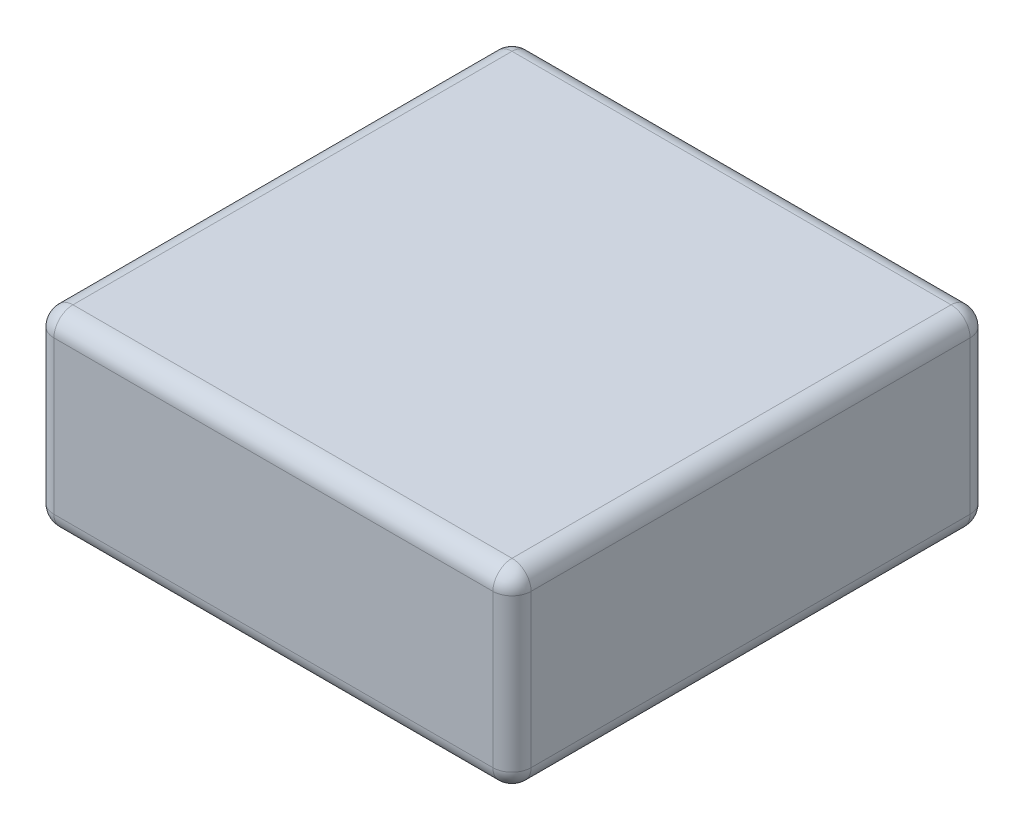
ISO-10303-21;
HEADER;
FILE_DESCRIPTION(('STEP AP214'),'2;1');
FILE_NAME('part.step','',(''),(''),'','','');
FILE_SCHEMA(('AUTOMOTIVE_DESIGN { 1 0 10303 214 1 1 1 1 }'));
ENDSEC;
DATA;
#1=APPLICATION_CONTEXT('core data for automotive mechanical design processes');
#2=APPLICATION_PROTOCOL_DEFINITION('international standard','automotive_design',2000,#1);
#3=PRODUCT_CONTEXT('',#1,'mechanical');
#4=PRODUCT('Part','Part','',(#3));
#5=PRODUCT_RELATED_PRODUCT_CATEGORY('part','',(#4));
#6=PRODUCT_DEFINITION_FORMATION('','',#4);
#7=PRODUCT_DEFINITION_CONTEXT('part definition',#1,'design');
#8=PRODUCT_DEFINITION('design','',#6,#7);
#9=PRODUCT_DEFINITION_SHAPE('','',#8);
#10=(LENGTH_UNIT() NAMED_UNIT(*) SI_UNIT(.MILLI.,.METRE.));
#11=(NAMED_UNIT(*) PLANE_ANGLE_UNIT() SI_UNIT($,.RADIAN.));
#12=(NAMED_UNIT(*) SI_UNIT($,.STERADIAN.) SOLID_ANGLE_UNIT());
#13=UNCERTAINTY_MEASURE_WITH_UNIT(LENGTH_MEASURE(1.E-05),#10,'distance_accuracy_value','');
#14=(GEOMETRIC_REPRESENTATION_CONTEXT(3) GLOBAL_UNCERTAINTY_ASSIGNED_CONTEXT((#13)) GLOBAL_UNIT_ASSIGNED_CONTEXT((#10,
#11,#12)) REPRESENTATION_CONTEXT('',''));
#15=CARTESIAN_POINT('',(0.,0.,0.));
#16=DIRECTION('',(0.,0.,1.));
#17=DIRECTION('',(1.,0.,0.));
#18=AXIS2_PLACEMENT_3D('',#15,#16,#17);
#19=CARTESIAN_POINT('',(25.,10.,25.));
#20=DIRECTION('',(-1.,0.,0.));
#21=DIRECTION('',(0.,0.,1.));
#22=AXIS2_PLACEMENT_3D('',#19,#20,#21);
#23=PLANE('',#22);
#24=DIRECTION('',(0.,0.,-1.));
#25=VECTOR('',#24,1.);
#26=CARTESIAN_POINT('',(25.,8.,25.));
#27=LINE('',#26,#25);
#28=CARTESIAN_POINT('',(25.,8.,-23.));
#29=VERTEX_POINT('',#28);
#30=CARTESIAN_POINT('',(25.,8.,23.));
#31=VERTEX_POINT('',#30);
#32=EDGE_CURVE('E163',#29,#31,#27,.F.);
#33=ORIENTED_EDGE('',*,*,#32,.T.);
#34=DIRECTION('',(0.,-1.,0.));
#35=VECTOR('',#34,1.);
#36=CARTESIAN_POINT('',(25.,10.,23.));
#37=LINE('',#36,#35);
#38=CARTESIAN_POINT('',(25.,-8.,23.));
#39=VERTEX_POINT('',#38);
#40=EDGE_CURVE('E166',#31,#39,#37,.T.);
#41=ORIENTED_EDGE('',*,*,#40,.T.);
#42=DIRECTION('',(0.,0.,-1.));
#43=VECTOR('',#42,1.);
#44=CARTESIAN_POINT('',(25.,-8.,-25.));
#45=LINE('',#44,#43);
#46=CARTESIAN_POINT('',(25.,-8.,-23.));
#47=VERTEX_POINT('',#46);
#48=EDGE_CURVE('E140',#39,#47,#45,.T.);
#49=ORIENTED_EDGE('',*,*,#48,.T.);
#50=DIRECTION('',(0.,-1.,0.));
#51=VECTOR('',#50,1.);
#52=CARTESIAN_POINT('',(25.,10.,-23.));
#53=LINE('',#52,#51);
#54=EDGE_CURVE('E158',#47,#29,#53,.F.);
#55=ORIENTED_EDGE('',*,*,#54,.T.);
#56=EDGE_LOOP('',(#33,#41,#49,#55));
#57=FACE_BOUND('',#56,.T.);
#58=ADVANCED_FACE('F43',(#57),#23,.F.);
#59=CARTESIAN_POINT('',(-25.,10.,-25.));
#60=DIRECTION('',(0.,0.,1.));
#61=DIRECTION('',(1.,0.,0.));
#62=AXIS2_PLACEMENT_3D('',#59,#60,#61);
#63=PLANE('',#62);
#64=DIRECTION('',(-1.,0.,0.));
#65=VECTOR('',#64,1.);
#66=CARTESIAN_POINT('',(-25.,-8.,-25.));
#67=LINE('',#66,#65);
#68=CARTESIAN_POINT('',(23.,-8.,-25.));
#69=VERTEX_POINT('',#68);
#70=CARTESIAN_POINT('',(-23.,-8.,-25.));
#71=VERTEX_POINT('',#70);
#72=EDGE_CURVE('E183',#69,#71,#67,.T.);
#73=ORIENTED_EDGE('',*,*,#72,.T.);
#74=DIRECTION('',(0.,-1.,0.));
#75=VECTOR('',#74,1.);
#76=CARTESIAN_POINT('',(-23.,10.,-25.));
#77=LINE('',#76,#75);
#78=CARTESIAN_POINT('',(-23.,8.,-25.));
#79=VERTEX_POINT('',#78);
#80=EDGE_CURVE('E186',#71,#79,#77,.F.);
#81=ORIENTED_EDGE('',*,*,#80,.T.);
#82=DIRECTION('',(-1.,0.,0.));
#83=VECTOR('',#82,1.);
#84=CARTESIAN_POINT('',(-25.,8.,-25.));
#85=LINE('',#84,#83);
#86=CARTESIAN_POINT('',(23.,8.,-25.));
#87=VERTEX_POINT('',#86);
#88=EDGE_CURVE('E181',#79,#87,#85,.F.);
#89=ORIENTED_EDGE('',*,*,#88,.T.);
#90=DIRECTION('',(0.,-1.,0.));
#91=VECTOR('',#90,1.);
#92=CARTESIAN_POINT('',(23.,10.,-25.));
#93=LINE('',#92,#91);
#94=EDGE_CURVE('E179',#87,#69,#93,.T.);
#95=ORIENTED_EDGE('',*,*,#94,.T.);
#96=EDGE_LOOP('',(#73,#81,#89,#95));
#97=FACE_BOUND('',#96,.T.);
#98=ADVANCED_FACE('F333',(#97),#63,.F.);
#99=CARTESIAN_POINT('',(-25.,10.,25.));
#100=DIRECTION('',(1.,0.,0.));
#101=DIRECTION('',(0.,0.,-1.));
#102=AXIS2_PLACEMENT_3D('',#99,#100,#101);
#103=PLANE('',#102);
#104=DIRECTION('',(0.,0.,1.));
#105=VECTOR('',#104,1.);
#106=CARTESIAN_POINT('',(-25.,8.,25.));
#107=LINE('',#106,#105);
#108=CARTESIAN_POINT('',(-25.,8.,23.));
#109=VERTEX_POINT('',#108);
#110=CARTESIAN_POINT('',(-25.,8.,-23.));
#111=VERTEX_POINT('',#110);
#112=EDGE_CURVE('E190',#109,#111,#107,.F.);
#113=ORIENTED_EDGE('',*,*,#112,.T.);
#114=DIRECTION('',(0.,-1.,0.));
#115=VECTOR('',#114,1.);
#116=CARTESIAN_POINT('',(-25.,10.,-23.));
#117=LINE('',#116,#115);
#118=CARTESIAN_POINT('',(-25.,-8.,-23.));
#119=VERTEX_POINT('',#118);
#120=EDGE_CURVE('E195',#111,#119,#117,.T.);
#121=ORIENTED_EDGE('',*,*,#120,.T.);
#122=DIRECTION('',(0.,0.,1.));
#123=VECTOR('',#122,1.);
#124=CARTESIAN_POINT('',(-25.,-8.,25.));
#125=LINE('',#124,#123);
#126=CARTESIAN_POINT('',(-25.,-8.,23.));
#127=VERTEX_POINT('',#126);
#128=EDGE_CURVE('E192',#119,#127,#125,.T.);
#129=ORIENTED_EDGE('',*,*,#128,.T.);
#130=DIRECTION('',(0.,-1.,0.));
#131=VECTOR('',#130,1.);
#132=CARTESIAN_POINT('',(-25.,10.,23.));
#133=LINE('',#132,#131);
#134=EDGE_CURVE('E188',#127,#109,#133,.F.);
#135=ORIENTED_EDGE('',*,*,#134,.T.);
#136=EDGE_LOOP('',(#113,#121,#129,#135));
#137=FACE_BOUND('',#136,.T.);
#138=ADVANCED_FACE('F303',(#137),#103,.F.);
#139=CARTESIAN_POINT('',(-25.,10.,25.));
#140=DIRECTION('',(0.,0.,-1.));
#141=DIRECTION('',(-1.,0.,0.));
#142=AXIS2_PLACEMENT_3D('',#139,#140,#141);
#143=PLANE('',#142);
#144=DIRECTION('',(1.,0.,0.));
#145=VECTOR('',#144,1.);
#146=CARTESIAN_POINT('',(25.,-8.,25.));
#147=LINE('',#146,#145);
#148=CARTESIAN_POINT('',(-23.,-8.,25.));
#149=VERTEX_POINT('',#148);
#150=CARTESIAN_POINT('',(23.,-8.,25.));
#151=VERTEX_POINT('',#150);
#152=EDGE_CURVE('E201',#149,#151,#147,.T.);
#153=ORIENTED_EDGE('',*,*,#152,.T.);
#154=DIRECTION('',(0.,-1.,0.));
#155=VECTOR('',#154,1.);
#156=CARTESIAN_POINT('',(23.,10.,25.));
#157=LINE('',#156,#155);
#158=CARTESIAN_POINT('',(23.,8.,25.));
#159=VERTEX_POINT('',#158);
#160=EDGE_CURVE('E204',#151,#159,#157,.F.);
#161=ORIENTED_EDGE('',*,*,#160,.T.);
#162=DIRECTION('',(1.,0.,0.));
#163=VECTOR('',#162,1.);
#164=CARTESIAN_POINT('',(-25.,8.,25.));
#165=LINE('',#164,#163);
#166=CARTESIAN_POINT('',(-23.,8.,25.));
#167=VERTEX_POINT('',#166);
#168=EDGE_CURVE('E199',#159,#167,#165,.F.);
#169=ORIENTED_EDGE('',*,*,#168,.T.);
#170=DIRECTION('',(0.,-1.,0.));
#171=VECTOR('',#170,1.);
#172=CARTESIAN_POINT('',(-23.,10.,25.));
#173=LINE('',#172,#171);
#174=EDGE_CURVE('E197',#167,#149,#173,.T.);
#175=ORIENTED_EDGE('',*,*,#174,.T.);
#176=EDGE_LOOP('',(#153,#161,#169,#175));
#177=FACE_BOUND('',#176,.T.);
#178=ADVANCED_FACE('F279',(#177),#143,.F.);
#179=CARTESIAN_POINT('',(0.,10.,0.));
#180=DIRECTION('',(0.,-1.,0.));
#181=DIRECTION('',(0.,0.,-1.));
#182=AXIS2_PLACEMENT_3D('',#179,#180,#181);
#183=PLANE('',#182);
#184=DIRECTION('',(1.,0.,0.));
#185=VECTOR('',#184,1.);
#186=CARTESIAN_POINT('',(0.,10.,23.));
#187=LINE('',#186,#185);
#188=CARTESIAN_POINT('',(-23.,10.,23.));
#189=VERTEX_POINT('',#188);
#190=CARTESIAN_POINT('',(23.,10.,23.));
#191=VERTEX_POINT('',#190);
#192=EDGE_CURVE('E206',#189,#191,#187,.T.);
#193=ORIENTED_EDGE('',*,*,#192,.T.);
#194=DIRECTION('',(0.,0.,-1.));
#195=VECTOR('',#194,1.);
#196=CARTESIAN_POINT('',(23.,10.,0.));
#197=LINE('',#196,#195);
#198=CARTESIAN_POINT('',(23.,10.,-23.));
#199=VERTEX_POINT('',#198);
#200=EDGE_CURVE('E11',#191,#199,#197,.T.);
#201=ORIENTED_EDGE('',*,*,#200,.T.);
#202=DIRECTION('',(-1.,0.,0.));
#203=VECTOR('',#202,1.);
#204=CARTESIAN_POINT('',(0.,10.,-23.));
#205=LINE('',#204,#203);
#206=CARTESIAN_POINT('',(-23.,10.,-23.));
#207=VERTEX_POINT('',#206);
#208=EDGE_CURVE('E52',#199,#207,#205,.T.);
#209=ORIENTED_EDGE('',*,*,#208,.T.);
#210=DIRECTION('',(0.,0.,1.));
#211=VECTOR('',#210,1.);
#212=CARTESIAN_POINT('',(-23.,10.,0.));
#213=LINE('',#212,#211);
#214=EDGE_CURVE('E208',#207,#189,#213,.T.);
#215=ORIENTED_EDGE('',*,*,#214,.T.);
#216=EDGE_LOOP('',(#193,#201,#209,#215));
#217=FACE_BOUND('',#216,.T.);
#218=ADVANCED_FACE('F287',(#217),#183,.F.);
#219=CARTESIAN_POINT('',(0.,-10.,0.));
#220=DIRECTION('',(0.,-1.,0.));
#221=DIRECTION('',(0.,0.,-1.));
#222=AXIS2_PLACEMENT_3D('',#219,#220,#221);
#223=PLANE('',#222);
#224=DIRECTION('',(-1.,0.,0.));
#225=VECTOR('',#224,1.);
#226=CARTESIAN_POINT('',(25.,-10.,-23.));
#227=LINE('',#226,#225);
#228=CARTESIAN_POINT('',(-23.,-10.,-23.));
#229=VERTEX_POINT('',#228);
#230=CARTESIAN_POINT('',(23.,-10.,-23.));
#231=VERTEX_POINT('',#230);
#232=EDGE_CURVE('E176',#229,#231,#227,.F.);
#233=ORIENTED_EDGE('',*,*,#232,.T.);
#234=DIRECTION('',(0.,0.,-1.));
#235=VECTOR('',#234,1.);
#236=CARTESIAN_POINT('',(23.,-10.,25.));
#237=LINE('',#236,#235);
#238=CARTESIAN_POINT('',(23.,-10.,23.));
#239=VERTEX_POINT('',#238);
#240=EDGE_CURVE('E142',#231,#239,#237,.F.);
#241=ORIENTED_EDGE('',*,*,#240,.T.);
#242=DIRECTION('',(1.,0.,0.));
#243=VECTOR('',#242,1.);
#244=CARTESIAN_POINT('',(-25.,-10.,23.));
#245=LINE('',#244,#243);
#246=CARTESIAN_POINT('',(-23.,-10.,23.));
#247=VERTEX_POINT('',#246);
#248=EDGE_CURVE('E169',#239,#247,#245,.F.);
#249=ORIENTED_EDGE('',*,*,#248,.T.);
#250=DIRECTION('',(0.,0.,1.));
#251=VECTOR('',#250,1.);
#252=CARTESIAN_POINT('',(-23.,-10.,-25.));
#253=LINE('',#252,#251);
#254=EDGE_CURVE('E174',#247,#229,#253,.F.);
#255=ORIENTED_EDGE('',*,*,#254,.T.);
#256=EDGE_LOOP('',(#233,#241,#249,#255));
#257=FACE_BOUND('',#256,.T.);
#258=ADVANCED_FACE('F366',(#257),#223,.T.);
#259=CARTESIAN_POINT('',(-23.,8.,0.));
#260=DIRECTION('',(0.,0.,1.));
#261=DIRECTION('',(1.,0.,0.));
#262=AXIS2_PLACEMENT_3D('',#259,#260,#261);
#263=CYLINDRICAL_SURFACE('',#262,2.);
#264=CARTESIAN_POINT('',(-23.,8.,23.));
#265=DIRECTION('',(0.,0.,1.));
#266=DIRECTION('',(1.,0.,0.));
#267=AXIS2_PLACEMENT_3D('',#264,#265,#266);
#268=CIRCLE('',#267,2.);
#269=EDGE_CURVE('E47',#189,#109,#268,.T.);
#270=ORIENTED_EDGE('',*,*,#269,.F.);
#271=ORIENTED_EDGE('',*,*,#214,.F.);
#272=CARTESIAN_POINT('',(-23.,8.,-23.));
#273=DIRECTION('',(0.,0.,-1.));
#274=DIRECTION('',(-1.,0.,0.));
#275=AXIS2_PLACEMENT_3D('',#272,#273,#274);
#276=CIRCLE('',#275,2.);
#277=EDGE_CURVE('E257',#111,#207,#276,.T.);
#278=ORIENTED_EDGE('',*,*,#277,.F.);
#279=ORIENTED_EDGE('',*,*,#112,.F.);
#280=EDGE_LOOP('',(#270,#271,#278,#279));
#281=FACE_BOUND('',#280,.T.);
#282=ADVANCED_FACE('F45',(#281),#263,.T.);
#283=CARTESIAN_POINT('',(-23.,8.,23.));
#284=DIRECTION('',(-1.,0.,0.));
#285=DIRECTION('',(0.,0.,1.));
#286=AXIS2_PLACEMENT_3D('',#283,#284,#285);
#287=SPHERICAL_SURFACE('',#286,2.);
#288=CARTESIAN_POINT('',(-23.,8.,23.));
#289=DIRECTION('',(-1.,0.,0.));
#290=DIRECTION('',(0.,0.,1.));
#291=AXIS2_PLACEMENT_3D('',#288,#289,#290);
#292=CIRCLE('',#291,2.);
#293=EDGE_CURVE('E252',#189,#167,#292,.F.);
#294=ORIENTED_EDGE('',*,*,#293,.F.);
#295=ORIENTED_EDGE('',*,*,#269,.T.);
#296=CARTESIAN_POINT('',(-23.,8.,23.));
#297=DIRECTION('',(0.,1.,0.));
#298=DIRECTION('',(0.,0.,1.));
#299=AXIS2_PLACEMENT_3D('',#296,#297,#298);
#300=CIRCLE('',#299,2.);
#301=EDGE_CURVE('E255',#167,#109,#300,.F.);
#302=ORIENTED_EDGE('',*,*,#301,.F.);
#303=EDGE_LOOP('',(#294,#295,#302));
#304=FACE_BOUND('',#303,.T.);
#305=ADVANCED_FACE('F268',(#304),#287,.T.);
#306=CARTESIAN_POINT('',(-23.,8.,-23.));
#307=DIRECTION('',(0.,1.,0.));
#308=DIRECTION('',(0.,0.,1.));
#309=AXIS2_PLACEMENT_3D('',#306,#307,#308);
#310=SPHERICAL_SURFACE('',#309,2.);
#311=CARTESIAN_POINT('',(-23.,8.,-23.));
#312=DIRECTION('',(0.,1.,0.));
#313=DIRECTION('',(0.,0.,1.));
#314=AXIS2_PLACEMENT_3D('',#311,#312,#313);
#315=CIRCLE('',#314,2.);
#316=EDGE_CURVE('E246',#111,#79,#315,.F.);
#317=ORIENTED_EDGE('',*,*,#316,.F.);
#318=ORIENTED_EDGE('',*,*,#277,.T.);
#319=CARTESIAN_POINT('',(-23.,8.,-23.));
#320=DIRECTION('',(-1.,0.,0.));
#321=DIRECTION('',(0.,0.,1.));
#322=AXIS2_PLACEMENT_3D('',#319,#320,#321);
#323=CIRCLE('',#322,2.);
#324=EDGE_CURVE('E249',#79,#207,#323,.F.);
#325=ORIENTED_EDGE('',*,*,#324,.F.);
#326=EDGE_LOOP('',(#317,#318,#325));
#327=FACE_BOUND('',#326,.T.);
#328=ADVANCED_FACE('F295',(#327),#310,.T.);
#329=CARTESIAN_POINT('',(-23.,10.,23.));
#330=DIRECTION('',(0.,-1.,0.));
#331=DIRECTION('',(0.,0.,-1.));
#332=AXIS2_PLACEMENT_3D('',#329,#330,#331);
#333=CYLINDRICAL_SURFACE('',#332,2.);
#334=ORIENTED_EDGE('',*,*,#301,.T.);
#335=ORIENTED_EDGE('',*,*,#134,.F.);
#336=CARTESIAN_POINT('',(-23.,-8.,23.));
#337=DIRECTION('',(0.,-1.,0.));
#338=DIRECTION('',(0.,0.,-1.));
#339=AXIS2_PLACEMENT_3D('',#336,#337,#338);
#340=CIRCLE('',#339,2.);
#341=EDGE_CURVE('E241',#149,#127,#340,.T.);
#342=ORIENTED_EDGE('',*,*,#341,.F.);
#343=ORIENTED_EDGE('',*,*,#174,.F.);
#344=EDGE_LOOP('',(#334,#335,#342,#343));
#345=FACE_BOUND('',#344,.T.);
#346=ADVANCED_FACE('F275',(#345),#333,.T.);
#347=CARTESIAN_POINT('',(0.,8.,23.));
#348=DIRECTION('',(1.,0.,0.));
#349=DIRECTION('',(0.,0.,-1.));
#350=AXIS2_PLACEMENT_3D('',#347,#348,#349);
#351=CYLINDRICAL_SURFACE('',#350,2.);
#352=ORIENTED_EDGE('',*,*,#293,.T.);
#353=ORIENTED_EDGE('',*,*,#168,.F.);
#354=CARTESIAN_POINT('',(23.,8.,23.));
#355=DIRECTION('',(1.,0.,0.));
#356=DIRECTION('',(0.,0.,-1.));
#357=AXIS2_PLACEMENT_3D('',#354,#355,#356);
#358=CIRCLE('',#357,2.);
#359=EDGE_CURVE('E238',#191,#159,#358,.T.);
#360=ORIENTED_EDGE('',*,*,#359,.F.);
#361=ORIENTED_EDGE('',*,*,#192,.F.);
#362=EDGE_LOOP('',(#352,#353,#360,#361));
#363=FACE_BOUND('',#362,.T.);
#364=ADVANCED_FACE('F285',(#363),#351,.T.);
#365=CARTESIAN_POINT('',(23.,8.,0.));
#366=DIRECTION('',(0.,0.,-1.));
#367=DIRECTION('',(-1.,0.,0.));
#368=AXIS2_PLACEMENT_3D('',#365,#366,#367);
#369=CYLINDRICAL_SURFACE('',#368,2.);
#370=CARTESIAN_POINT('',(23.,8.,-23.));
#371=DIRECTION('',(0.,0.,-1.));
#372=DIRECTION('',(-1.,0.,0.));
#373=AXIS2_PLACEMENT_3D('',#370,#371,#372);
#374=CIRCLE('',#373,2.);
#375=EDGE_CURVE('E233',#199,#29,#374,.T.);
#376=ORIENTED_EDGE('',*,*,#375,.F.);
#377=ORIENTED_EDGE('',*,*,#200,.F.);
#378=CARTESIAN_POINT('',(23.,8.,23.));
#379=DIRECTION('',(0.,0.,1.));
#380=DIRECTION('',(1.,0.,0.));
#381=AXIS2_PLACEMENT_3D('',#378,#379,#380);
#382=CIRCLE('',#381,2.);
#383=EDGE_CURVE('E235',#31,#191,#382,.T.);
#384=ORIENTED_EDGE('',*,*,#383,.F.);
#385=ORIENTED_EDGE('',*,*,#32,.F.);
#386=EDGE_LOOP('',(#376,#377,#384,#385));
#387=FACE_BOUND('',#386,.T.);
#388=ADVANCED_FACE('F290',(#387),#369,.T.);
#389=CARTESIAN_POINT('',(0.,8.,-23.));
#390=DIRECTION('',(-1.,0.,0.));
#391=DIRECTION('',(0.,0.,1.));
#392=AXIS2_PLACEMENT_3D('',#389,#390,#391);
#393=CYLINDRICAL_SURFACE('',#392,2.);
#394=ORIENTED_EDGE('',*,*,#324,.T.);
#395=ORIENTED_EDGE('',*,*,#208,.F.);
#396=CARTESIAN_POINT('',(23.,8.,-23.));
#397=DIRECTION('',(1.,0.,0.));
#398=DIRECTION('',(0.,0.,-1.));
#399=AXIS2_PLACEMENT_3D('',#396,#397,#398);
#400=CIRCLE('',#399,2.);
#401=EDGE_CURVE('E60',#87,#199,#400,.T.);
#402=ORIENTED_EDGE('',*,*,#401,.F.);
#403=ORIENTED_EDGE('',*,*,#88,.F.);
#404=EDGE_LOOP('',(#394,#395,#402,#403));
#405=FACE_BOUND('',#404,.T.);
#406=ADVANCED_FACE('F293',(#405),#393,.T.);
#407=CARTESIAN_POINT('',(-23.,10.,-23.));
#408=DIRECTION('',(0.,-1.,0.));
#409=DIRECTION('',(0.,0.,-1.));
#410=AXIS2_PLACEMENT_3D('',#407,#408,#409);
#411=CYLINDRICAL_SURFACE('',#410,2.);
#412=ORIENTED_EDGE('',*,*,#316,.T.);
#413=ORIENTED_EDGE('',*,*,#80,.F.);
#414=CARTESIAN_POINT('',(-23.,-8.,-23.));
#415=DIRECTION('',(0.,-1.,0.));
#416=DIRECTION('',(0.,0.,-1.));
#417=AXIS2_PLACEMENT_3D('',#414,#415,#416);
#418=CIRCLE('',#417,2.);
#419=EDGE_CURVE('E229',#119,#71,#418,.T.);
#420=ORIENTED_EDGE('',*,*,#419,.F.);
#421=ORIENTED_EDGE('',*,*,#120,.F.);
#422=EDGE_LOOP('',(#412,#413,#420,#421));
#423=FACE_BOUND('',#422,.T.);
#424=ADVANCED_FACE('F300',(#423),#411,.T.);
#425=CARTESIAN_POINT('',(-23.,-8.,25.));
#426=DIRECTION('',(0.,0.,-1.));
#427=DIRECTION('',(-1.,0.,0.));
#428=AXIS2_PLACEMENT_3D('',#425,#426,#427);
#429=CYLINDRICAL_SURFACE('',#428,2.);
#430=CARTESIAN_POINT('',(-23.,-8.,23.));
#431=DIRECTION('',(0.,0.,1.));
#432=DIRECTION('',(1.,0.,0.));
#433=AXIS2_PLACEMENT_3D('',#430,#431,#432);
#434=CIRCLE('',#433,2.);
#435=EDGE_CURVE('E243',#127,#247,#434,.T.);
#436=ORIENTED_EDGE('',*,*,#435,.F.);
#437=ORIENTED_EDGE('',*,*,#128,.F.);
#438=CARTESIAN_POINT('',(-23.,-8.,-23.));
#439=DIRECTION('',(0.,0.,-1.));
#440=DIRECTION('',(-1.,0.,0.));
#441=AXIS2_PLACEMENT_3D('',#438,#439,#440);
#442=CIRCLE('',#441,2.);
#443=EDGE_CURVE('E226',#229,#119,#442,.T.);
#444=ORIENTED_EDGE('',*,*,#443,.F.);
#445=ORIENTED_EDGE('',*,*,#254,.F.);
#446=EDGE_LOOP('',(#436,#437,#444,#445));
#447=FACE_BOUND('',#446,.T.);
#448=ADVANCED_FACE('F307',(#447),#429,.T.);
#449=CARTESIAN_POINT('',(-23.,-8.,23.));
#450=DIRECTION('',(-1.,0.,0.));
#451=DIRECTION('',(0.,-1.,0.));
#452=AXIS2_PLACEMENT_3D('',#449,#450,#451);
#453=SPHERICAL_SURFACE('',#452,2.);
#454=ORIENTED_EDGE('',*,*,#341,.T.);
#455=ORIENTED_EDGE('',*,*,#435,.T.);
#456=CARTESIAN_POINT('',(-23.,-8.,23.));
#457=DIRECTION('',(-1.,0.,0.));
#458=DIRECTION('',(0.,0.,1.));
#459=AXIS2_PLACEMENT_3D('',#456,#457,#458);
#460=CIRCLE('',#459,2.);
#461=EDGE_CURVE('E223',#149,#247,#460,.F.);
#462=ORIENTED_EDGE('',*,*,#461,.F.);
#463=EDGE_LOOP('',(#454,#455,#462));
#464=FACE_BOUND('',#463,.T.);
#465=ADVANCED_FACE('F311',(#464),#453,.T.);
#466=CARTESIAN_POINT('',(23.,8.,23.));
#467=DIRECTION('',(0.,1.,0.));
#468=DIRECTION('',(0.,0.,1.));
#469=AXIS2_PLACEMENT_3D('',#466,#467,#468);
#470=SPHERICAL_SURFACE('',#469,2.);
#471=ORIENTED_EDGE('',*,*,#383,.T.);
#472=ORIENTED_EDGE('',*,*,#359,.T.);
#473=CARTESIAN_POINT('',(23.,8.,23.));
#474=DIRECTION('',(0.,1.,0.));
#475=DIRECTION('',(0.,0.,1.));
#476=AXIS2_PLACEMENT_3D('',#473,#474,#475);
#477=CIRCLE('',#476,2.);
#478=EDGE_CURVE('E220',#31,#159,#477,.F.);
#479=ORIENTED_EDGE('',*,*,#478,.F.);
#480=EDGE_LOOP('',(#471,#472,#479));
#481=FACE_BOUND('',#480,.T.);
#482=ADVANCED_FACE('F321',(#481),#470,.T.);
#483=CARTESIAN_POINT('',(23.,8.,-23.));
#484=DIRECTION('',(0.,1.,0.));
#485=DIRECTION('',(0.,0.,1.));
#486=AXIS2_PLACEMENT_3D('',#483,#484,#485);
#487=SPHERICAL_SURFACE('',#486,2.);
#488=ORIENTED_EDGE('',*,*,#401,.T.);
#489=ORIENTED_EDGE('',*,*,#375,.T.);
#490=CARTESIAN_POINT('',(23.,8.,-23.));
#491=DIRECTION('',(0.,1.,0.));
#492=DIRECTION('',(0.,0.,1.));
#493=AXIS2_PLACEMENT_3D('',#490,#491,#492);
#494=CIRCLE('',#493,2.);
#495=EDGE_CURVE('E160',#87,#29,#494,.F.);
#496=ORIENTED_EDGE('',*,*,#495,.F.);
#497=EDGE_LOOP('',(#488,#489,#496));
#498=FACE_BOUND('',#497,.T.);
#499=ADVANCED_FACE('F323',(#498),#487,.T.);
#500=CARTESIAN_POINT('',(-23.,-8.,-23.));
#501=DIRECTION('',(-1.,0.,0.));
#502=DIRECTION('',(0.,-1.,0.));
#503=AXIS2_PLACEMENT_3D('',#500,#501,#502);
#504=SPHERICAL_SURFACE('',#503,2.);
#505=ORIENTED_EDGE('',*,*,#443,.T.);
#506=ORIENTED_EDGE('',*,*,#419,.T.);
#507=CARTESIAN_POINT('',(-23.,-8.,-23.));
#508=DIRECTION('',(-1.,0.,0.));
#509=DIRECTION('',(0.,0.,1.));
#510=AXIS2_PLACEMENT_3D('',#507,#508,#509);
#511=CIRCLE('',#510,2.);
#512=EDGE_CURVE('E217',#229,#71,#511,.F.);
#513=ORIENTED_EDGE('',*,*,#512,.F.);
#514=EDGE_LOOP('',(#505,#506,#513));
#515=FACE_BOUND('',#514,.T.);
#516=ADVANCED_FACE('F329',(#515),#504,.T.);
#517=CARTESIAN_POINT('',(-25.,-8.,23.));
#518=DIRECTION('',(-1.,0.,0.));
#519=DIRECTION('',(0.,0.,1.));
#520=AXIS2_PLACEMENT_3D('',#517,#518,#519);
#521=CYLINDRICAL_SURFACE('',#520,2.);
#522=ORIENTED_EDGE('',*,*,#461,.T.);
#523=ORIENTED_EDGE('',*,*,#248,.F.);
#524=CARTESIAN_POINT('',(23.,-8.,23.));
#525=DIRECTION('',(1.,0.,0.));
#526=DIRECTION('',(0.,0.,-1.));
#527=AXIS2_PLACEMENT_3D('',#524,#525,#526);
#528=CIRCLE('',#527,2.);
#529=EDGE_CURVE('E214',#151,#239,#528,.T.);
#530=ORIENTED_EDGE('',*,*,#529,.F.);
#531=ORIENTED_EDGE('',*,*,#152,.F.);
#532=EDGE_LOOP('',(#522,#523,#530,#531));
#533=FACE_BOUND('',#532,.T.);
#534=ADVANCED_FACE('F314',(#533),#521,.T.);
#535=CARTESIAN_POINT('',(23.,10.,23.));
#536=DIRECTION('',(0.,-1.,0.));
#537=DIRECTION('',(0.,0.,-1.));
#538=AXIS2_PLACEMENT_3D('',#535,#536,#537);
#539=CYLINDRICAL_SURFACE('',#538,2.);
#540=ORIENTED_EDGE('',*,*,#478,.T.);
#541=ORIENTED_EDGE('',*,*,#160,.F.);
#542=CARTESIAN_POINT('',(23.,-8.,23.));
#543=DIRECTION('',(0.,-1.,0.));
#544=DIRECTION('',(0.,0.,-1.));
#545=AXIS2_PLACEMENT_3D('',#542,#543,#544);
#546=CIRCLE('',#545,2.);
#547=EDGE_CURVE('E155',#39,#151,#546,.T.);
#548=ORIENTED_EDGE('',*,*,#547,.F.);
#549=ORIENTED_EDGE('',*,*,#40,.F.);
#550=EDGE_LOOP('',(#540,#541,#548,#549));
#551=FACE_BOUND('',#550,.T.);
#552=ADVANCED_FACE('F319',(#551),#539,.T.);
#553=CARTESIAN_POINT('',(23.,10.,-23.));
#554=DIRECTION('',(0.,-1.,0.));
#555=DIRECTION('',(0.,0.,-1.));
#556=AXIS2_PLACEMENT_3D('',#553,#554,#555);
#557=CYLINDRICAL_SURFACE('',#556,2.);
#558=ORIENTED_EDGE('',*,*,#495,.T.);
#559=ORIENTED_EDGE('',*,*,#54,.F.);
#560=CARTESIAN_POINT('',(23.,-8.,-23.));
#561=DIRECTION('',(0.,-1.,0.));
#562=DIRECTION('',(0.,0.,-1.));
#563=AXIS2_PLACEMENT_3D('',#560,#561,#562);
#564=CIRCLE('',#563,2.);
#565=EDGE_CURVE('E148',#69,#47,#564,.T.);
#566=ORIENTED_EDGE('',*,*,#565,.F.);
#567=ORIENTED_EDGE('',*,*,#94,.F.);
#568=EDGE_LOOP('',(#558,#559,#566,#567));
#569=FACE_BOUND('',#568,.T.);
#570=ADVANCED_FACE('F159',(#569),#557,.T.);
#571=CARTESIAN_POINT('',(-25.,-8.,-23.));
#572=DIRECTION('',(1.,0.,0.));
#573=DIRECTION('',(0.,0.,-1.));
#574=AXIS2_PLACEMENT_3D('',#571,#572,#573);
#575=CYLINDRICAL_SURFACE('',#574,2.);
#576=ORIENTED_EDGE('',*,*,#512,.T.);
#577=ORIENTED_EDGE('',*,*,#72,.F.);
#578=CARTESIAN_POINT('',(23.,-8.,-23.));
#579=DIRECTION('',(1.,0.,0.));
#580=DIRECTION('',(0.,0.,-1.));
#581=AXIS2_PLACEMENT_3D('',#578,#579,#580);
#582=CIRCLE('',#581,2.);
#583=EDGE_CURVE('E152',#231,#69,#582,.T.);
#584=ORIENTED_EDGE('',*,*,#583,.F.);
#585=ORIENTED_EDGE('',*,*,#232,.F.);
#586=EDGE_LOOP('',(#576,#577,#584,#585));
#587=FACE_BOUND('',#586,.T.);
#588=ADVANCED_FACE('F349',(#587),#575,.T.);
#589=CARTESIAN_POINT('',(23.,-8.,23.));
#590=DIRECTION('',(0.,0.,1.));
#591=DIRECTION('',(0.,-1.,0.));
#592=AXIS2_PLACEMENT_3D('',#589,#590,#591);
#593=SPHERICAL_SURFACE('',#592,2.);
#594=ORIENTED_EDGE('',*,*,#547,.T.);
#595=ORIENTED_EDGE('',*,*,#529,.T.);
#596=CARTESIAN_POINT('',(23.,-8.,23.));
#597=DIRECTION('',(0.,0.,1.));
#598=DIRECTION('',(1.,0.,0.));
#599=AXIS2_PLACEMENT_3D('',#596,#597,#598);
#600=CIRCLE('',#599,2.);
#601=EDGE_CURVE('E145',#39,#239,#600,.F.);
#602=ORIENTED_EDGE('',*,*,#601,.F.);
#603=EDGE_LOOP('',(#594,#595,#602));
#604=FACE_BOUND('',#603,.T.);
#605=ADVANCED_FACE('F346',(#604),#593,.T.);
#606=CARTESIAN_POINT('',(23.,-8.,-23.));
#607=DIRECTION('',(0.,0.,-1.));
#608=DIRECTION('',(0.,1.,0.));
#609=AXIS2_PLACEMENT_3D('',#606,#607,#608);
#610=SPHERICAL_SURFACE('',#609,2.);
#611=ORIENTED_EDGE('',*,*,#583,.T.);
#612=ORIENTED_EDGE('',*,*,#565,.T.);
#613=CARTESIAN_POINT('',(23.,-8.,-23.));
#614=DIRECTION('',(0.,0.,-1.));
#615=DIRECTION('',(-1.,0.,0.));
#616=AXIS2_PLACEMENT_3D('',#613,#614,#615);
#617=CIRCLE('',#616,2.);
#618=EDGE_CURVE('E136',#231,#47,#617,.F.);
#619=ORIENTED_EDGE('',*,*,#618,.F.);
#620=EDGE_LOOP('',(#611,#612,#619));
#621=FACE_BOUND('',#620,.T.);
#622=ADVANCED_FACE('F150',(#621),#610,.T.);
#623=CARTESIAN_POINT('',(23.,-8.,25.));
#624=DIRECTION('',(0.,0.,1.));
#625=DIRECTION('',(1.,0.,0.));
#626=AXIS2_PLACEMENT_3D('',#623,#624,#625);
#627=CYLINDRICAL_SURFACE('',#626,2.);
#628=ORIENTED_EDGE('',*,*,#601,.T.);
#629=ORIENTED_EDGE('',*,*,#240,.F.);
#630=ORIENTED_EDGE('',*,*,#618,.T.);
#631=ORIENTED_EDGE('',*,*,#48,.F.);
#632=EDGE_LOOP('',(#628,#629,#630,#631));
#633=FACE_BOUND('',#632,.T.);
#634=ADVANCED_FACE('F138',(#633),#627,.T.);
#635=CLOSED_SHELL('',(#58,#98,#138,#178,#218,#258,#282,#305,#328,#346,#364,#388,#406,#424,#448,
#465,#482,#499,#516,#534,#552,#570,#588,#605,#622,#634));
#636=MANIFOLD_SOLID_BREP('B2',#635);
#637=ADVANCED_BREP_SHAPE_REPRESENTATION('',(#18,#636),#14);
#638=SHAPE_DEFINITION_REPRESENTATION(#9,#637);
ENDSEC;
END-ISO-10303-21;
